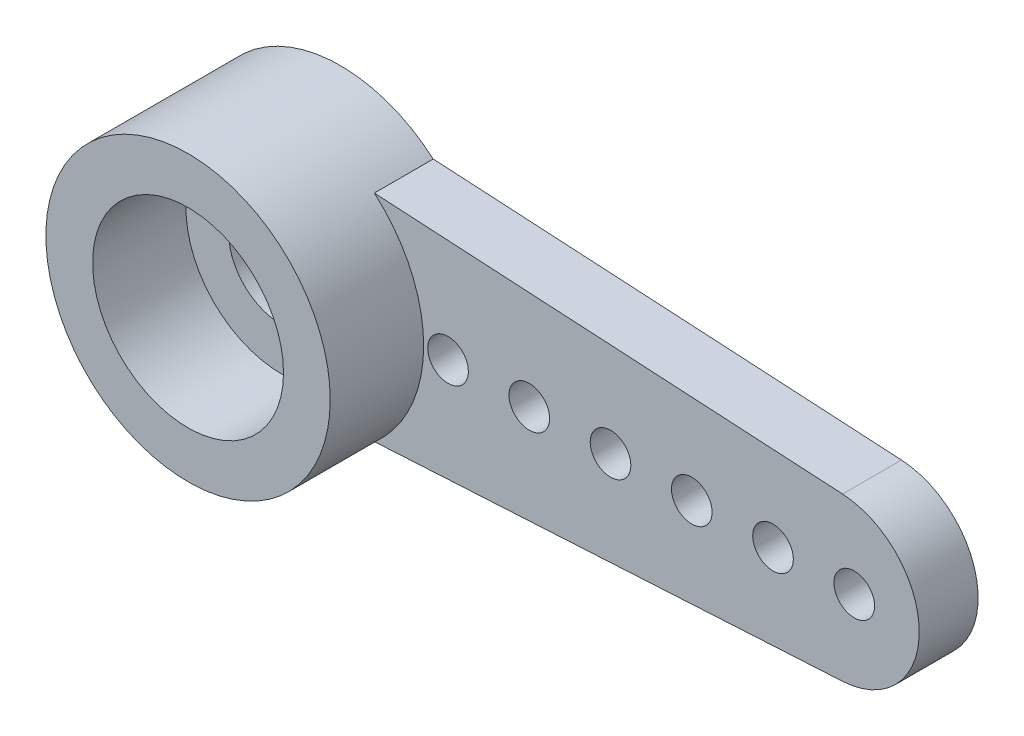
ISO-10303-21;
HEADER;
FILE_DESCRIPTION(('STEP AP214'),'2;1');
FILE_NAME('part.step','',(''),(''),'','','');
FILE_SCHEMA(('AUTOMOTIVE_DESIGN { 1 0 10303 214 1 1 1 1 }'));
ENDSEC;
DATA;
#1=APPLICATION_CONTEXT('core data for automotive mechanical design processes');
#2=APPLICATION_PROTOCOL_DEFINITION('international standard','automotive_design',2000,#1);
#3=PRODUCT_CONTEXT('',#1,'mechanical');
#4=PRODUCT('Part','Part','',(#3));
#5=PRODUCT_RELATED_PRODUCT_CATEGORY('part','',(#4));
#6=PRODUCT_DEFINITION_FORMATION('','',#4);
#7=PRODUCT_DEFINITION_CONTEXT('part definition',#1,'design');
#8=PRODUCT_DEFINITION('design','',#6,#7);
#9=PRODUCT_DEFINITION_SHAPE('','',#8);
#10=(LENGTH_UNIT() NAMED_UNIT(*) SI_UNIT(.MILLI.,.METRE.));
#11=(NAMED_UNIT(*) PLANE_ANGLE_UNIT() SI_UNIT($,.RADIAN.));
#12=(NAMED_UNIT(*) SI_UNIT($,.STERADIAN.) SOLID_ANGLE_UNIT());
#13=UNCERTAINTY_MEASURE_WITH_UNIT(LENGTH_MEASURE(1.E-05),#10,'distance_accuracy_value','');
#14=(GEOMETRIC_REPRESENTATION_CONTEXT(3) GLOBAL_UNCERTAINTY_ASSIGNED_CONTEXT((#13)) GLOBAL_UNIT_ASSIGNED_CONTEXT((#10,
#11,#12)) REPRESENTATION_CONTEXT('',''));
#15=CARTESIAN_POINT('',(0.,0.,0.));
#16=DIRECTION('',(0.,0.,1.));
#17=DIRECTION('',(1.,0.,0.));
#18=AXIS2_PLACEMENT_3D('',#15,#16,#17);
#19=CARTESIAN_POINT('',(4.1,0.,3.75));
#20=DIRECTION('',(0.,0.,-1.));
#21=DIRECTION('',(-1.,0.,0.));
#22=AXIS2_PLACEMENT_3D('',#19,#20,#21);
#23=CYLINDRICAL_SURFACE('',#22,0.500000000000001);
#24=CARTESIAN_POINT('',(4.1,0.,1.45));
#25=DIRECTION('',(0.,0.,1.));
#26=DIRECTION('',(1.,0.,0.));
#27=AXIS2_PLACEMENT_3D('',#24,#25,#26);
#28=CIRCLE('',#27,0.500000000000001);
#29=CARTESIAN_POINT('',(4.6,0.,1.45));
#30=VERTEX_POINT('',#29);
#31=EDGE_CURVE('E44',#30,#30,#28,.T.);
#32=ORIENTED_EDGE('',*,*,#31,.T.);
#33=EDGE_LOOP('',(#32));
#34=FACE_BOUND('',#33,.T.);
#35=CARTESIAN_POINT('',(4.1,0.,0.));
#36=DIRECTION('',(0.,0.,-1.));
#37=DIRECTION('',(-1.,0.,0.));
#38=AXIS2_PLACEMENT_3D('',#35,#36,#37);
#39=CIRCLE('',#38,0.500000000000001);
#40=CARTESIAN_POINT('',(3.6,0.,0.));
#41=VERTEX_POINT('',#40);
#42=EDGE_CURVE('E11',#41,#41,#39,.T.);
#43=ORIENTED_EDGE('',*,*,#42,.T.);
#44=EDGE_LOOP('',(#43));
#45=FACE_BOUND('',#44,.T.);
#46=ADVANCED_FACE('F36',(#34,#45),#23,.F.);
#47=CARTESIAN_POINT('',(6.1,0.,3.75));
#48=DIRECTION('',(0.,0.,-1.));
#49=DIRECTION('',(-1.,0.,0.));
#50=AXIS2_PLACEMENT_3D('',#47,#48,#49);
#51=CYLINDRICAL_SURFACE('',#50,0.500000000000001);
#52=CARTESIAN_POINT('',(6.1,0.,1.45));
#53=DIRECTION('',(0.,0.,1.));
#54=DIRECTION('',(1.,0.,0.));
#55=AXIS2_PLACEMENT_3D('',#52,#53,#54);
#56=CIRCLE('',#55,0.500000000000001);
#57=CARTESIAN_POINT('',(6.6,0.,1.45));
#58=VERTEX_POINT('',#57);
#59=EDGE_CURVE('E132',#58,#58,#56,.T.);
#60=ORIENTED_EDGE('',*,*,#59,.T.);
#61=EDGE_LOOP('',(#60));
#62=FACE_BOUND('',#61,.T.);
#63=CARTESIAN_POINT('',(6.1,0.,0.));
#64=DIRECTION('',(0.,0.,-1.));
#65=DIRECTION('',(-1.,0.,0.));
#66=AXIS2_PLACEMENT_3D('',#63,#64,#65);
#67=CIRCLE('',#66,0.500000000000001);
#68=CARTESIAN_POINT('',(5.6,0.,0.));
#69=VERTEX_POINT('',#68);
#70=EDGE_CURVE('E135',#69,#69,#67,.T.);
#71=ORIENTED_EDGE('',*,*,#70,.T.);
#72=EDGE_LOOP('',(#71));
#73=FACE_BOUND('',#72,.T.);
#74=ADVANCED_FACE('F164',(#62,#73),#51,.F.);
#75=CARTESIAN_POINT('',(8.1,0.,3.75));
#76=DIRECTION('',(0.,0.,-1.));
#77=DIRECTION('',(-1.,0.,0.));
#78=AXIS2_PLACEMENT_3D('',#75,#76,#77);
#79=CYLINDRICAL_SURFACE('',#78,0.500000000000001);
#80=CARTESIAN_POINT('',(8.1,0.,1.45));
#81=DIRECTION('',(0.,0.,1.));
#82=DIRECTION('',(1.,0.,0.));
#83=AXIS2_PLACEMENT_3D('',#80,#81,#82);
#84=CIRCLE('',#83,0.500000000000001);
#85=CARTESIAN_POINT('',(8.6,0.,1.45));
#86=VERTEX_POINT('',#85);
#87=EDGE_CURVE('E126',#86,#86,#84,.T.);
#88=ORIENTED_EDGE('',*,*,#87,.T.);
#89=EDGE_LOOP('',(#88));
#90=FACE_BOUND('',#89,.T.);
#91=CARTESIAN_POINT('',(8.1,0.,0.));
#92=DIRECTION('',(0.,0.,-1.));
#93=DIRECTION('',(-1.,0.,0.));
#94=AXIS2_PLACEMENT_3D('',#91,#92,#93);
#95=CIRCLE('',#94,0.500000000000001);
#96=CARTESIAN_POINT('',(7.6,0.,0.));
#97=VERTEX_POINT('',#96);
#98=EDGE_CURVE('E129',#97,#97,#95,.T.);
#99=ORIENTED_EDGE('',*,*,#98,.T.);
#100=EDGE_LOOP('',(#99));
#101=FACE_BOUND('',#100,.T.);
#102=ADVANCED_FACE('F168',(#90,#101),#79,.F.);
#103=CARTESIAN_POINT('',(10.1,0.,3.75));
#104=DIRECTION('',(0.,0.,-1.));
#105=DIRECTION('',(-1.,0.,0.));
#106=AXIS2_PLACEMENT_3D('',#103,#104,#105);
#107=CYLINDRICAL_SURFACE('',#106,0.500000000000001);
#108=CARTESIAN_POINT('',(10.1,0.,1.45));
#109=DIRECTION('',(0.,0.,1.));
#110=DIRECTION('',(1.,0.,0.));
#111=AXIS2_PLACEMENT_3D('',#108,#109,#110);
#112=CIRCLE('',#111,0.500000000000001);
#113=CARTESIAN_POINT('',(10.6,0.,1.45));
#114=VERTEX_POINT('',#113);
#115=EDGE_CURVE('E95',#114,#114,#112,.T.);
#116=ORIENTED_EDGE('',*,*,#115,.T.);
#117=EDGE_LOOP('',(#116));
#118=FACE_BOUND('',#117,.T.);
#119=CARTESIAN_POINT('',(10.1,0.,0.));
#120=DIRECTION('',(0.,0.,-1.));
#121=DIRECTION('',(-1.,0.,0.));
#122=AXIS2_PLACEMENT_3D('',#119,#120,#121);
#123=CIRCLE('',#122,0.500000000000001);
#124=CARTESIAN_POINT('',(9.6,0.,0.));
#125=VERTEX_POINT('',#124);
#126=EDGE_CURVE('E98',#125,#125,#123,.T.);
#127=ORIENTED_EDGE('',*,*,#126,.T.);
#128=EDGE_LOOP('',(#127));
#129=FACE_BOUND('',#128,.T.);
#130=ADVANCED_FACE('F173',(#118,#129),#107,.F.);
#131=CARTESIAN_POINT('',(0.,0.,1.45));
#132=DIRECTION('',(0.,0.,-1.));
#133=DIRECTION('',(-1.,0.,0.));
#134=AXIS2_PLACEMENT_3D('',#131,#132,#133);
#135=CYLINDRICAL_SURFACE('',#134,3.5);
#136=CARTESIAN_POINT('',(0.,0.,0.));
#137=DIRECTION('',(0.,0.,1.));
#138=DIRECTION('',(1.,0.,0.));
#139=AXIS2_PLACEMENT_3D('',#136,#137,#138);
#140=CIRCLE('',#139,3.5);
#141=CARTESIAN_POINT('',(2.28637267303473,2.65,0.));
#142=VERTEX_POINT('',#141);
#143=CARTESIAN_POINT('',(2.28637267303473,-2.65,0.));
#144=VERTEX_POINT('',#143);
#145=EDGE_CURVE('E109',#142,#144,#140,.T.);
#146=ORIENTED_EDGE('',*,*,#145,.T.);
#147=DIRECTION('',(0.,0.,-1.));
#148=VECTOR('',#147,1.);
#149=CARTESIAN_POINT('',(2.28637267303473,-2.65,1.45));
#150=LINE('',#149,#148);
#151=CARTESIAN_POINT('',(2.28637267303473,-2.65,1.45));
#152=VERTEX_POINT('',#151);
#153=EDGE_CURVE('E93',#152,#144,#150,.T.);
#154=ORIENTED_EDGE('',*,*,#153,.F.);
#155=CARTESIAN_POINT('',(0.,0.,1.45));
#156=DIRECTION('',(0.,0.,1.));
#157=DIRECTION('',(1.,0.,0.));
#158=AXIS2_PLACEMENT_3D('',#155,#156,#157);
#159=CIRCLE('',#158,3.5);
#160=CARTESIAN_POINT('',(2.28637267303473,2.65,1.45));
#161=VERTEX_POINT('',#160);
#162=EDGE_CURVE('E80',#152,#161,#159,.T.);
#163=ORIENTED_EDGE('',*,*,#162,.T.);
#164=DIRECTION('',(0.,0.,-1.));
#165=VECTOR('',#164,1.);
#166=CARTESIAN_POINT('',(2.28637267303473,2.65,1.45));
#167=LINE('',#166,#165);
#168=EDGE_CURVE('E77',#161,#142,#167,.T.);
#169=ORIENTED_EDGE('',*,*,#168,.T.);
#170=EDGE_LOOP('',(#146,#154,#163,#169));
#171=FACE_BOUND('',#170,.T.);
#172=CARTESIAN_POINT('',(0.,0.,3.75));
#173=DIRECTION('',(0.,0.,1.));
#174=DIRECTION('',(1.,0.,0.));
#175=AXIS2_PLACEMENT_3D('',#172,#173,#174);
#176=CIRCLE('',#175,3.5);
#177=CARTESIAN_POINT('',(3.5,0.,3.75));
#178=VERTEX_POINT('',#177);
#179=EDGE_CURVE('E104',#178,#178,#176,.T.);
#180=ORIENTED_EDGE('',*,*,#179,.F.);
#181=EDGE_LOOP('',(#180));
#182=FACE_BOUND('',#181,.T.);
#183=ADVANCED_FACE('F91',(#171,#182),#135,.T.);
#184=CARTESIAN_POINT('',(0.157009117572814,-2.77066749041223,1.45));
#185=DIRECTION('',(0.0565775654992932,-0.998398206670151,0.));
#186=DIRECTION('',(0.998398206670151,0.0565775654992932,0.));
#187=AXIS2_PLACEMENT_3D('',#184,#185,#186);
#188=PLANE('',#187);
#189=DIRECTION('',(-0.998398206670151,-0.0565775654992932,0.));
#190=VECTOR('',#189,1.);
#191=CARTESIAN_POINT('',(0.157009117572814,-2.77066749041223,0.));
#192=LINE('',#191,#190);
#193=CARTESIAN_POINT('',(13.8131551309986,-1.9967964133403,0.));
#194=VERTEX_POINT('',#193);
#195=EDGE_CURVE('E111',#194,#144,#192,.T.);
#196=ORIENTED_EDGE('',*,*,#195,.F.);
#197=DIRECTION('',(0.,0.,-1.));
#198=VECTOR('',#197,1.);
#199=CARTESIAN_POINT('',(13.8131551309986,-1.9967964133403,1.45));
#200=LINE('',#199,#198);
#201=CARTESIAN_POINT('',(13.8131551309986,-1.9967964133403,1.45));
#202=VERTEX_POINT('',#201);
#203=EDGE_CURVE('E100',#202,#194,#200,.T.);
#204=ORIENTED_EDGE('',*,*,#203,.F.);
#205=DIRECTION('',(-0.998398206670151,-0.0565775654992932,0.));
#206=VECTOR('',#205,1.);
#207=CARTESIAN_POINT('',(0.157009117572814,-2.77066749041223,1.45));
#208=LINE('',#207,#206);
#209=EDGE_CURVE('E106',#202,#152,#208,.T.);
#210=ORIENTED_EDGE('',*,*,#209,.T.);
#211=ORIENTED_EDGE('',*,*,#153,.T.);
#212=EDGE_LOOP('',(#196,#204,#210,#211));
#213=FACE_BOUND('',#212,.T.);
#214=ADVANCED_FACE('F183',(#213),#188,.T.);
#215=CARTESIAN_POINT('',(13.7,0.,1.45));
#216=DIRECTION('',(0.,0.,-1.));
#217=DIRECTION('',(-1.,0.,0.));
#218=AXIS2_PLACEMENT_3D('',#215,#216,#217);
#219=CYLINDRICAL_SURFACE('',#218,2.);
#220=CARTESIAN_POINT('',(13.7,0.,0.));
#221=DIRECTION('',(0.,0.,1.));
#222=DIRECTION('',(1.,0.,0.));
#223=AXIS2_PLACEMENT_3D('',#220,#221,#222);
#224=CIRCLE('',#223,2.);
#225=CARTESIAN_POINT('',(13.8131551309986,1.9967964133403,0.));
#226=VERTEX_POINT('',#225);
#227=EDGE_CURVE('E114',#194,#226,#224,.T.);
#228=ORIENTED_EDGE('',*,*,#227,.T.);
#229=DIRECTION('',(0.,0.,-1.));
#230=VECTOR('',#229,1.);
#231=CARTESIAN_POINT('',(13.8131551309986,1.9967964133403,1.45));
#232=LINE('',#231,#230);
#233=CARTESIAN_POINT('',(13.8131551309986,1.9967964133403,1.45));
#234=VERTEX_POINT('',#233);
#235=EDGE_CURVE('E70',#234,#226,#232,.T.);
#236=ORIENTED_EDGE('',*,*,#235,.F.);
#237=CARTESIAN_POINT('',(13.7,0.,1.45));
#238=DIRECTION('',(0.,0.,1.));
#239=DIRECTION('',(1.,0.,0.));
#240=AXIS2_PLACEMENT_3D('',#237,#238,#239);
#241=CIRCLE('',#240,2.);
#242=EDGE_CURVE('E52',#202,#234,#241,.T.);
#243=ORIENTED_EDGE('',*,*,#242,.F.);
#244=ORIENTED_EDGE('',*,*,#203,.T.);
#245=EDGE_LOOP('',(#228,#236,#243,#244));
#246=FACE_BOUND('',#245,.T.);
#247=ADVANCED_FACE('F154',(#246),#219,.T.);
#248=CARTESIAN_POINT('',(0.157009117572814,2.77066749041223,1.45));
#249=DIRECTION('',(0.0565775654992932,0.998398206670151,0.));
#250=DIRECTION('',(-0.998398206670151,0.0565775654992932,0.));
#251=AXIS2_PLACEMENT_3D('',#248,#249,#250);
#252=PLANE('',#251);
#253=DIRECTION('',(0.998398206670151,-0.0565775654992932,0.));
#254=VECTOR('',#253,1.);
#255=CARTESIAN_POINT('',(0.157009117572814,2.77066749041223,0.));
#256=LINE('',#255,#254);
#257=EDGE_CURVE('E89',#142,#226,#256,.T.);
#258=ORIENTED_EDGE('',*,*,#257,.F.);
#259=ORIENTED_EDGE('',*,*,#168,.F.);
#260=DIRECTION('',(0.998398206670151,-0.0565775654992932,0.));
#261=VECTOR('',#260,1.);
#262=CARTESIAN_POINT('',(0.157009117572814,2.77066749041223,1.45));
#263=LINE('',#262,#261);
#264=EDGE_CURVE('E83',#161,#234,#263,.T.);
#265=ORIENTED_EDGE('',*,*,#264,.T.);
#266=ORIENTED_EDGE('',*,*,#235,.T.);
#267=EDGE_LOOP('',(#258,#259,#265,#266));
#268=FACE_BOUND('',#267,.T.);
#269=ADVANCED_FACE('F87',(#268),#252,.T.);
#270=CARTESIAN_POINT('',(0.,0.,1.45));
#271=DIRECTION('',(0.,0.,1.));
#272=DIRECTION('',(1.,0.,0.));
#273=AXIS2_PLACEMENT_3D('',#270,#271,#272);
#274=PLANE('',#273);
#275=CARTESIAN_POINT('',(12.1,0.,1.45));
#276=DIRECTION('',(0.,0.,1.));
#277=DIRECTION('',(1.,0.,0.));
#278=AXIS2_PLACEMENT_3D('',#275,#276,#277);
#279=CIRCLE('',#278,0.500000000000001);
#280=CARTESIAN_POINT('',(12.6,0.,1.45));
#281=VERTEX_POINT('',#280);
#282=EDGE_CURVE('E335',#281,#281,#279,.T.);
#283=ORIENTED_EDGE('',*,*,#282,.F.);
#284=EDGE_LOOP('',(#283));
#285=FACE_BOUND('',#284,.T.);
#286=CARTESIAN_POINT('',(14.1,0.,1.45));
#287=DIRECTION('',(0.,0.,1.));
#288=DIRECTION('',(1.,0.,0.));
#289=AXIS2_PLACEMENT_3D('',#286,#287,#288);
#290=CIRCLE('',#289,0.500000000000001);
#291=CARTESIAN_POINT('',(14.6,0.,1.45));
#292=VERTEX_POINT('',#291);
#293=EDGE_CURVE('E342',#292,#292,#290,.T.);
#294=ORIENTED_EDGE('',*,*,#293,.F.);
#295=EDGE_LOOP('',(#294));
#296=FACE_BOUND('',#295,.T.);
#297=ORIENTED_EDGE('',*,*,#162,.F.);
#298=ORIENTED_EDGE('',*,*,#209,.F.);
#299=ORIENTED_EDGE('',*,*,#242,.T.);
#300=ORIENTED_EDGE('',*,*,#264,.F.);
#301=EDGE_LOOP('',(#297,#298,#299,#300));
#302=FACE_BOUND('',#301,.T.);
#303=ORIENTED_EDGE('',*,*,#115,.F.);
#304=EDGE_LOOP('',(#303));
#305=FACE_BOUND('',#304,.T.);
#306=ORIENTED_EDGE('',*,*,#87,.F.);
#307=EDGE_LOOP('',(#306));
#308=FACE_BOUND('',#307,.T.);
#309=ORIENTED_EDGE('',*,*,#59,.F.);
#310=EDGE_LOOP('',(#309));
#311=FACE_BOUND('',#310,.T.);
#312=ORIENTED_EDGE('',*,*,#31,.F.);
#313=EDGE_LOOP('',(#312));
#314=FACE_BOUND('',#313,.T.);
#315=ADVANCED_FACE('F84',(#285,#296,#302,#305,#308,#311,#314),#274,.T.);
#316=CARTESIAN_POINT('',(0.,0.,0.));
#317=DIRECTION('',(0.,0.,1.));
#318=DIRECTION('',(1.,0.,0.));
#319=AXIS2_PLACEMENT_3D('',#316,#317,#318);
#320=PLANE('',#319);
#321=CARTESIAN_POINT('',(12.1,0.,0.));
#322=DIRECTION('',(0.,0.,-1.));
#323=DIRECTION('',(-1.,0.,0.));
#324=AXIS2_PLACEMENT_3D('',#321,#322,#323);
#325=CIRCLE('',#324,0.500000000000001);
#326=CARTESIAN_POINT('',(11.6,0.,0.));
#327=VERTEX_POINT('',#326);
#328=EDGE_CURVE('E338',#327,#327,#325,.T.);
#329=ORIENTED_EDGE('',*,*,#328,.F.);
#330=EDGE_LOOP('',(#329));
#331=FACE_BOUND('',#330,.T.);
#332=CARTESIAN_POINT('',(14.1,0.,0.));
#333=DIRECTION('',(0.,0.,-1.));
#334=DIRECTION('',(-1.,0.,0.));
#335=AXIS2_PLACEMENT_3D('',#332,#333,#334);
#336=CIRCLE('',#335,0.500000000000001);
#337=CARTESIAN_POINT('',(13.6,0.,0.));
#338=VERTEX_POINT('',#337);
#339=EDGE_CURVE('E339',#338,#338,#336,.T.);
#340=ORIENTED_EDGE('',*,*,#339,.F.);
#341=EDGE_LOOP('',(#340));
#342=FACE_BOUND('',#341,.T.);
#343=CARTESIAN_POINT('',(0.,0.,0.));
#344=DIRECTION('',(0.,0.,-1.));
#345=DIRECTION('',(-1.,0.,0.));
#346=AXIS2_PLACEMENT_3D('',#343,#344,#345);
#347=CIRCLE('',#346,2.3);
#348=CARTESIAN_POINT('',(-2.3,0.,0.));
#349=VERTEX_POINT('',#348);
#350=EDGE_CURVE('E121',#349,#349,#347,.T.);
#351=ORIENTED_EDGE('',*,*,#350,.F.);
#352=EDGE_LOOP('',(#351));
#353=FACE_BOUND('',#352,.T.);
#354=ORIENTED_EDGE('',*,*,#145,.F.);
#355=ORIENTED_EDGE('',*,*,#257,.T.);
#356=ORIENTED_EDGE('',*,*,#227,.F.);
#357=ORIENTED_EDGE('',*,*,#195,.T.);
#358=EDGE_LOOP('',(#354,#355,#356,#357));
#359=FACE_BOUND('',#358,.T.);
#360=ORIENTED_EDGE('',*,*,#126,.F.);
#361=EDGE_LOOP('',(#360));
#362=FACE_BOUND('',#361,.T.);
#363=ORIENTED_EDGE('',*,*,#98,.F.);
#364=EDGE_LOOP('',(#363));
#365=FACE_BOUND('',#364,.T.);
#366=ORIENTED_EDGE('',*,*,#70,.F.);
#367=EDGE_LOOP('',(#366));
#368=FACE_BOUND('',#367,.T.);
#369=ORIENTED_EDGE('',*,*,#42,.F.);
#370=EDGE_LOOP('',(#369));
#371=FACE_BOUND('',#370,.T.);
#372=ADVANCED_FACE('F143',(#331,#342,#353,#359,#362,#365,#368,#371),#320,.F.);
#373=CARTESIAN_POINT('',(0.,0.,3.75));
#374=DIRECTION('',(0.,0.,1.));
#375=DIRECTION('',(1.,0.,0.));
#376=AXIS2_PLACEMENT_3D('',#373,#374,#375);
#377=PLANE('',#376);
#378=ORIENTED_EDGE('',*,*,#179,.T.);
#379=EDGE_LOOP('',(#378));
#380=FACE_BOUND('',#379,.T.);
#381=CARTESIAN_POINT('',(0.,0.,3.75));
#382=DIRECTION('',(0.,0.,1.));
#383=DIRECTION('',(1.,0.,0.));
#384=AXIS2_PLACEMENT_3D('',#381,#382,#383);
#385=CIRCLE('',#384,2.35);
#386=CARTESIAN_POINT('',(2.35,0.,3.75));
#387=VERTEX_POINT('',#386);
#388=EDGE_CURVE('E356',#387,#387,#385,.T.);
#389=ORIENTED_EDGE('',*,*,#388,.F.);
#390=EDGE_LOOP('',(#389));
#391=FACE_BOUND('',#390,.T.);
#392=ADVANCED_FACE('F151',(#380,#391),#377,.T.);
#393=CARTESIAN_POINT('',(0.,0.,3.75));
#394=DIRECTION('',(0.,0.,-1.));
#395=DIRECTION('',(-1.,0.,0.));
#396=AXIS2_PLACEMENT_3D('',#393,#394,#395);
#397=CYLINDRICAL_SURFACE('',#396,2.35);
#398=ORIENTED_EDGE('',*,*,#388,.T.);
#399=EDGE_LOOP('',(#398));
#400=FACE_BOUND('',#399,.T.);
#401=CARTESIAN_POINT('',(0.,0.,1.45));
#402=DIRECTION('',(0.,0.,1.));
#403=DIRECTION('',(1.,0.,0.));
#404=AXIS2_PLACEMENT_3D('',#401,#402,#403);
#405=CIRCLE('',#404,2.35);
#406=CARTESIAN_POINT('',(2.35,0.,1.45));
#407=VERTEX_POINT('',#406);
#408=EDGE_CURVE('E353',#407,#407,#405,.T.);
#409=ORIENTED_EDGE('',*,*,#408,.F.);
#410=EDGE_LOOP('',(#409));
#411=FACE_BOUND('',#410,.T.);
#412=ADVANCED_FACE('F161',(#400,#411),#397,.F.);
#413=CARTESIAN_POINT('',(0.,0.,1.45));
#414=DIRECTION('',(0.,0.,1.));
#415=DIRECTION('',(1.,0.,0.));
#416=AXIS2_PLACEMENT_3D('',#413,#414,#415);
#417=CIRCLE('',#416,1.3);
#418=CARTESIAN_POINT('',(1.3,0.,1.45));
#419=VERTEX_POINT('',#418);
#420=EDGE_CURVE('E119',#419,#419,#417,.T.);
#421=ORIENTED_EDGE('',*,*,#420,.F.);
#422=EDGE_LOOP('',(#421));
#423=FACE_BOUND('',#422,.T.);
#424=ORIENTED_EDGE('',*,*,#408,.T.);
#425=EDGE_LOOP('',(#424));
#426=FACE_BOUND('',#425,.T.);
#427=ADVANCED_FACE('F146',(#423,#426),#274,.T.);
#428=CARTESIAN_POINT('',(0.,0.,0.7));
#429=DIRECTION('',(0.,0.,-1.));
#430=DIRECTION('',(-1.,0.,0.));
#431=AXIS2_PLACEMENT_3D('',#428,#429,#430);
#432=CYLINDRICAL_SURFACE('',#431,2.3);
#433=CARTESIAN_POINT('',(0.,0.,0.7));
#434=DIRECTION('',(0.,0.,-1.));
#435=DIRECTION('',(-1.,0.,0.));
#436=AXIS2_PLACEMENT_3D('',#433,#434,#435);
#437=CIRCLE('',#436,2.3);
#438=CARTESIAN_POINT('',(-2.3,0.,0.7));
#439=VERTEX_POINT('',#438);
#440=EDGE_CURVE('E350',#439,#439,#437,.T.);
#441=ORIENTED_EDGE('',*,*,#440,.F.);
#442=EDGE_LOOP('',(#441));
#443=FACE_BOUND('',#442,.T.);
#444=ORIENTED_EDGE('',*,*,#350,.T.);
#445=EDGE_LOOP('',(#444));
#446=FACE_BOUND('',#445,.T.);
#447=ADVANCED_FACE('F160',(#443,#446),#432,.F.);
#448=CARTESIAN_POINT('',(0.,0.,0.7));
#449=DIRECTION('',(0.,0.,-1.));
#450=DIRECTION('',(-1.,0.,0.));
#451=AXIS2_PLACEMENT_3D('',#448,#449,#450);
#452=PLANE('',#451);
#453=CARTESIAN_POINT('',(0.,0.,0.7));
#454=DIRECTION('',(0.,0.,-1.));
#455=DIRECTION('',(-1.,0.,0.));
#456=AXIS2_PLACEMENT_3D('',#453,#454,#455);
#457=CIRCLE('',#456,1.3);
#458=CARTESIAN_POINT('',(-1.3,0.,0.7));
#459=VERTEX_POINT('',#458);
#460=EDGE_CURVE('E122',#459,#459,#457,.T.);
#461=ORIENTED_EDGE('',*,*,#460,.F.);
#462=EDGE_LOOP('',(#461));
#463=FACE_BOUND('',#462,.T.);
#464=ORIENTED_EDGE('',*,*,#440,.T.);
#465=EDGE_LOOP('',(#464));
#466=FACE_BOUND('',#465,.T.);
#467=ADVANCED_FACE('F249',(#463,#466),#452,.T.);
#468=CARTESIAN_POINT('',(0.,0.,3.75));
#469=DIRECTION('',(0.,0.,-1.));
#470=DIRECTION('',(-1.,0.,0.));
#471=AXIS2_PLACEMENT_3D('',#468,#469,#470);
#472=CYLINDRICAL_SURFACE('',#471,1.3);
#473=ORIENTED_EDGE('',*,*,#420,.T.);
#474=EDGE_LOOP('',(#473));
#475=FACE_BOUND('',#474,.T.);
#476=ORIENTED_EDGE('',*,*,#460,.T.);
#477=EDGE_LOOP('',(#476));
#478=FACE_BOUND('',#477,.T.);
#479=ADVANCED_FACE('F265',(#475,#478),#472,.F.);
#480=CARTESIAN_POINT('',(14.1,0.,3.75));
#481=DIRECTION('',(0.,0.,-1.));
#482=DIRECTION('',(-1.,0.,0.));
#483=AXIS2_PLACEMENT_3D('',#480,#481,#482);
#484=CYLINDRICAL_SURFACE('',#483,0.500000000000001);
#485=ORIENTED_EDGE('',*,*,#293,.T.);
#486=EDGE_LOOP('',(#485));
#487=FACE_BOUND('',#486,.T.);
#488=ORIENTED_EDGE('',*,*,#339,.T.);
#489=EDGE_LOOP('',(#488));
#490=FACE_BOUND('',#489,.T.);
#491=ADVANCED_FACE('F275',(#487,#490),#484,.F.);
#492=CARTESIAN_POINT('',(12.1,0.,3.75));
#493=DIRECTION('',(0.,0.,-1.));
#494=DIRECTION('',(-1.,0.,0.));
#495=AXIS2_PLACEMENT_3D('',#492,#493,#494);
#496=CYLINDRICAL_SURFACE('',#495,0.500000000000001);
#497=ORIENTED_EDGE('',*,*,#282,.T.);
#498=EDGE_LOOP('',(#497));
#499=FACE_BOUND('',#498,.T.);
#500=ORIENTED_EDGE('',*,*,#328,.T.);
#501=EDGE_LOOP('',(#500));
#502=FACE_BOUND('',#501,.T.);
#503=ADVANCED_FACE('F284',(#499,#502),#496,.F.);
#504=CLOSED_SHELL('',(#46,#74,#102,#130,#183,#214,#247,#269,#315,#372,#392,#412,#427,#447,#467,
#479,#491,#503));
#505=MANIFOLD_SOLID_BREP('B2',#504);
#506=ADVANCED_BREP_SHAPE_REPRESENTATION('',(#18,#505),#14);
#507=SHAPE_DEFINITION_REPRESENTATION(#9,#506);
ENDSEC;
END-ISO-10303-21;
